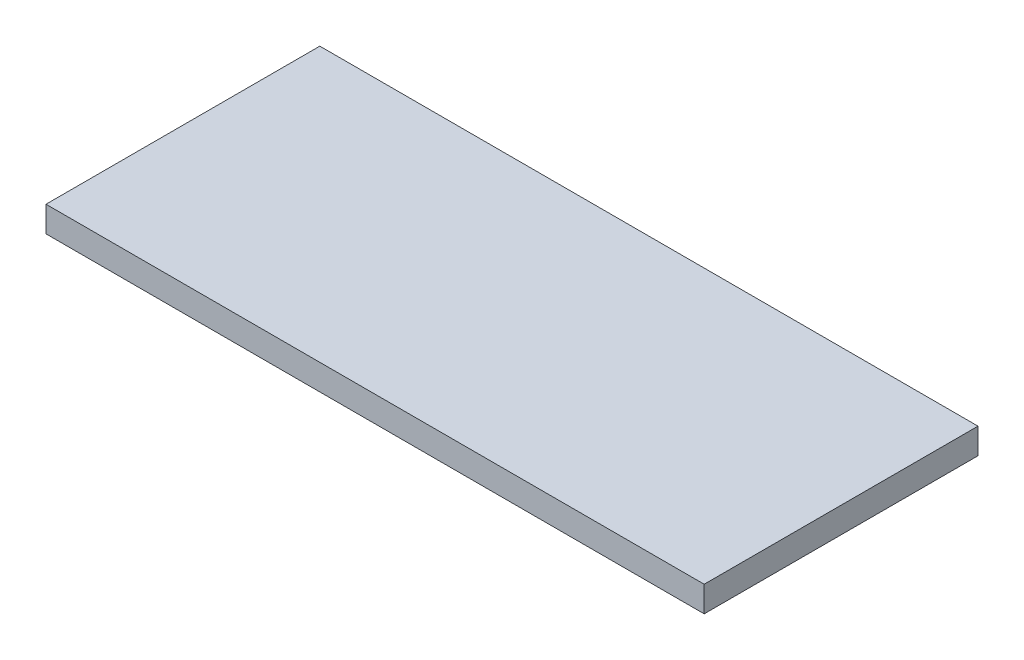
ISO-10303-21;
HEADER;
FILE_DESCRIPTION(('STEP AP214'),'2;1');
FILE_NAME('part.step','',(''),(''),'','','');
FILE_SCHEMA(('AUTOMOTIVE_DESIGN { 1 0 10303 214 1 1 1 1 }'));
ENDSEC;
DATA;
#1=APPLICATION_CONTEXT('core data for automotive mechanical design processes');
#2=APPLICATION_PROTOCOL_DEFINITION('international standard','automotive_design',2000,#1);
#3=PRODUCT_CONTEXT('',#1,'mechanical');
#4=PRODUCT('Part','Part','',(#3));
#5=PRODUCT_RELATED_PRODUCT_CATEGORY('part','',(#4));
#6=PRODUCT_DEFINITION_FORMATION('','',#4);
#7=PRODUCT_DEFINITION_CONTEXT('part definition',#1,'design');
#8=PRODUCT_DEFINITION('design','',#6,#7);
#9=PRODUCT_DEFINITION_SHAPE('','',#8);
#10=(LENGTH_UNIT() NAMED_UNIT(*) SI_UNIT(.MILLI.,.METRE.));
#11=(NAMED_UNIT(*) PLANE_ANGLE_UNIT() SI_UNIT($,.RADIAN.));
#12=(NAMED_UNIT(*) SI_UNIT($,.STERADIAN.) SOLID_ANGLE_UNIT());
#13=UNCERTAINTY_MEASURE_WITH_UNIT(LENGTH_MEASURE(1.E-05),#10,'distance_accuracy_value','');
#14=(GEOMETRIC_REPRESENTATION_CONTEXT(3) GLOBAL_UNCERTAINTY_ASSIGNED_CONTEXT((#13)) GLOBAL_UNIT_ASSIGNED_CONTEXT((#10,
#11,#12)) REPRESENTATION_CONTEXT('',''));
#15=CARTESIAN_POINT('',(0.,0.,0.));
#16=DIRECTION('',(0.,0.,1.));
#17=DIRECTION('',(1.,0.,0.));
#18=AXIS2_PLACEMENT_3D('',#15,#16,#17);
#19=CARTESIAN_POINT('',(122.1105,4.7625,0.));
#20=DIRECTION('',(0.,0.,-1.));
#21=DIRECTION('',(-1.,0.,0.));
#22=AXIS2_PLACEMENT_3D('',#19,#20,#21);
#23=PLANE('',#22);
#24=DIRECTION('',(1.,0.,0.));
#25=VECTOR('',#24,1.);
#26=CARTESIAN_POINT('',(122.1105,0.,0.));
#27=LINE('',#26,#25);
#28=CARTESIAN_POINT('',(0.,0.,0.));
#29=VERTEX_POINT('',#28);
#30=CARTESIAN_POINT('',(122.1105,0.,0.));
#31=VERTEX_POINT('',#30);
#32=EDGE_CURVE('E96',#29,#31,#27,.T.);
#33=ORIENTED_EDGE('',*,*,#32,.T.);
#34=DIRECTION('',(0.,-1.,0.));
#35=VECTOR('',#34,1.);
#36=CARTESIAN_POINT('',(122.1105,4.7625,0.));
#37=LINE('',#36,#35);
#38=CARTESIAN_POINT('',(122.1105,4.7625,0.));
#39=VERTEX_POINT('',#38);
#40=EDGE_CURVE('E11',#39,#31,#37,.T.);
#41=ORIENTED_EDGE('',*,*,#40,.F.);
#42=DIRECTION('',(1.,0.,0.));
#43=VECTOR('',#42,1.);
#44=CARTESIAN_POINT('',(122.1105,4.7625,0.));
#45=LINE('',#44,#43);
#46=CARTESIAN_POINT('',(0.,4.7625,0.));
#47=VERTEX_POINT('',#46);
#48=EDGE_CURVE('E84',#47,#39,#45,.T.);
#49=ORIENTED_EDGE('',*,*,#48,.F.);
#50=DIRECTION('',(0.,-1.,0.));
#51=VECTOR('',#50,1.);
#52=CARTESIAN_POINT('',(0.,4.7625,0.));
#53=LINE('',#52,#51);
#54=EDGE_CURVE('E92',#47,#29,#53,.T.);
#55=ORIENTED_EDGE('',*,*,#54,.T.);
#56=EDGE_LOOP('',(#33,#41,#49,#55));
#57=FACE_BOUND('',#56,.T.);
#58=ADVANCED_FACE('F33',(#57),#23,.F.);
#59=CARTESIAN_POINT('',(122.1105,4.7625,-50.8));
#60=DIRECTION('',(-1.,0.,0.));
#61=DIRECTION('',(0.,0.,1.));
#62=AXIS2_PLACEMENT_3D('',#59,#60,#61);
#63=PLANE('',#62);
#64=DIRECTION('',(0.,0.,-1.));
#65=VECTOR('',#64,1.);
#66=CARTESIAN_POINT('',(122.1105,0.,-50.8));
#67=LINE('',#66,#65);
#68=CARTESIAN_POINT('',(122.1105,0.,-50.8));
#69=VERTEX_POINT('',#68);
#70=EDGE_CURVE('E88',#31,#69,#67,.T.);
#71=ORIENTED_EDGE('',*,*,#70,.T.);
#72=DIRECTION('',(0.,-1.,0.));
#73=VECTOR('',#72,1.);
#74=CARTESIAN_POINT('',(122.1105,4.7625,-50.8));
#75=LINE('',#74,#73);
#76=CARTESIAN_POINT('',(122.1105,4.7625,-50.8));
#77=VERTEX_POINT('',#76);
#78=EDGE_CURVE('E41',#77,#69,#75,.T.);
#79=ORIENTED_EDGE('',*,*,#78,.F.);
#80=DIRECTION('',(0.,0.,-1.));
#81=VECTOR('',#80,1.);
#82=CARTESIAN_POINT('',(122.1105,4.7625,-50.8));
#83=LINE('',#82,#81);
#84=EDGE_CURVE('E79',#39,#77,#83,.T.);
#85=ORIENTED_EDGE('',*,*,#84,.F.);
#86=ORIENTED_EDGE('',*,*,#40,.T.);
#87=EDGE_LOOP('',(#71,#79,#85,#86));
#88=FACE_BOUND('',#87,.T.);
#89=ADVANCED_FACE('F87',(#88),#63,.F.);
#90=CARTESIAN_POINT('',(0.,4.7625,-50.8));
#91=DIRECTION('',(0.,0.,1.));
#92=DIRECTION('',(1.,0.,0.));
#93=AXIS2_PLACEMENT_3D('',#90,#91,#92);
#94=PLANE('',#93);
#95=DIRECTION('',(-1.,0.,0.));
#96=VECTOR('',#95,1.);
#97=CARTESIAN_POINT('',(0.,0.,-50.8));
#98=LINE('',#97,#96);
#99=CARTESIAN_POINT('',(0.,0.,-50.8));
#100=VERTEX_POINT('',#99);
#101=EDGE_CURVE('E66',#69,#100,#98,.T.);
#102=ORIENTED_EDGE('',*,*,#101,.T.);
#103=DIRECTION('',(0.,-1.,0.));
#104=VECTOR('',#103,1.);
#105=CARTESIAN_POINT('',(0.,4.7625,-50.8));
#106=LINE('',#105,#104);
#107=CARTESIAN_POINT('',(0.,4.7625,-50.8));
#108=VERTEX_POINT('',#107);
#109=EDGE_CURVE('E89',#108,#100,#106,.T.);
#110=ORIENTED_EDGE('',*,*,#109,.F.);
#111=DIRECTION('',(-1.,0.,0.));
#112=VECTOR('',#111,1.);
#113=CARTESIAN_POINT('',(0.,4.7625,-50.8));
#114=LINE('',#113,#112);
#115=EDGE_CURVE('E82',#77,#108,#114,.T.);
#116=ORIENTED_EDGE('',*,*,#115,.F.);
#117=ORIENTED_EDGE('',*,*,#78,.T.);
#118=EDGE_LOOP('',(#102,#110,#116,#117));
#119=FACE_BOUND('',#118,.T.);
#120=ADVANCED_FACE('F90',(#119),#94,.F.);
#121=CARTESIAN_POINT('',(0.,4.7625,0.));
#122=DIRECTION('',(1.,0.,0.));
#123=DIRECTION('',(0.,0.,-1.));
#124=AXIS2_PLACEMENT_3D('',#121,#122,#123);
#125=PLANE('',#124);
#126=DIRECTION('',(0.,0.,1.));
#127=VECTOR('',#126,1.);
#128=CARTESIAN_POINT('',(0.,0.,0.));
#129=LINE('',#128,#127);
#130=EDGE_CURVE('E72',#100,#29,#129,.T.);
#131=ORIENTED_EDGE('',*,*,#130,.T.);
#132=ORIENTED_EDGE('',*,*,#54,.F.);
#133=DIRECTION('',(0.,0.,1.));
#134=VECTOR('',#133,1.);
#135=CARTESIAN_POINT('',(0.,4.7625,0.));
#136=LINE('',#135,#134);
#137=EDGE_CURVE('E49',#108,#47,#136,.T.);
#138=ORIENTED_EDGE('',*,*,#137,.F.);
#139=ORIENTED_EDGE('',*,*,#109,.T.);
#140=EDGE_LOOP('',(#131,#132,#138,#139));
#141=FACE_BOUND('',#140,.T.);
#142=ADVANCED_FACE('F103',(#141),#125,.F.);
#143=CARTESIAN_POINT('',(0.,4.7625,0.));
#144=DIRECTION('',(0.,-1.,0.));
#145=DIRECTION('',(0.,0.,-1.));
#146=AXIS2_PLACEMENT_3D('',#143,#144,#145);
#147=PLANE('',#146);
#148=ORIENTED_EDGE('',*,*,#48,.T.);
#149=ORIENTED_EDGE('',*,*,#84,.T.);
#150=ORIENTED_EDGE('',*,*,#115,.T.);
#151=ORIENTED_EDGE('',*,*,#137,.T.);
#152=EDGE_LOOP('',(#148,#149,#150,#151));
#153=FACE_BOUND('',#152,.T.);
#154=ADVANCED_FACE('F80',(#153),#147,.F.);
#155=CARTESIAN_POINT('',(0.,0.,0.));
#156=DIRECTION('',(0.,-1.,0.));
#157=DIRECTION('',(0.,0.,-1.));
#158=AXIS2_PLACEMENT_3D('',#155,#156,#157);
#159=PLANE('',#158);
#160=ORIENTED_EDGE('',*,*,#32,.F.);
#161=ORIENTED_EDGE('',*,*,#130,.F.);
#162=ORIENTED_EDGE('',*,*,#101,.F.);
#163=ORIENTED_EDGE('',*,*,#70,.F.);
#164=EDGE_LOOP('',(#160,#161,#162,#163));
#165=FACE_BOUND('',#164,.T.);
#166=ADVANCED_FACE('F106',(#165),#159,.T.);
#167=CLOSED_SHELL('',(#58,#89,#120,#142,#154,#166));
#168=MANIFOLD_SOLID_BREP('B2',#167);
#169=ADVANCED_BREP_SHAPE_REPRESENTATION('',(#18,#168),#14);
#170=SHAPE_DEFINITION_REPRESENTATION(#9,#169);
ENDSEC;
END-ISO-10303-21;
